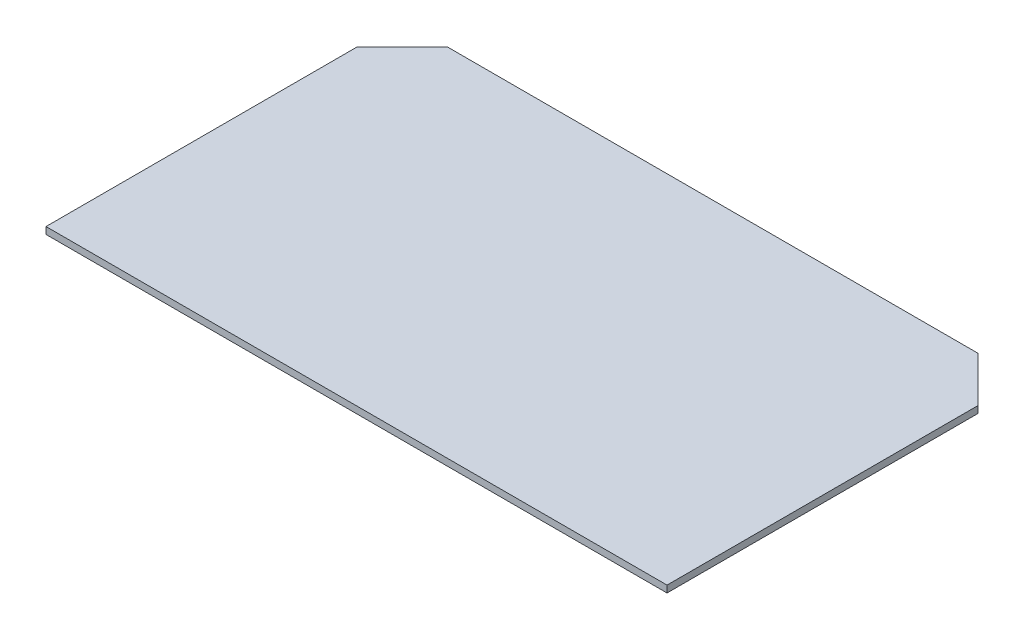
ISO-10303-21;
HEADER;
FILE_DESCRIPTION(('STEP AP214'),'2;1');
FILE_NAME('part.step','',(''),(''),'','','');
FILE_SCHEMA(('AUTOMOTIVE_DESIGN { 1 0 10303 214 1 1 1 1 }'));
ENDSEC;
DATA;
#1=APPLICATION_CONTEXT('core data for automotive mechanical design processes');
#2=APPLICATION_PROTOCOL_DEFINITION('international standard','automotive_design',2000,#1);
#3=PRODUCT_CONTEXT('',#1,'mechanical');
#4=PRODUCT('Part','Part','',(#3));
#5=PRODUCT_RELATED_PRODUCT_CATEGORY('part','',(#4));
#6=PRODUCT_DEFINITION_FORMATION('','',#4);
#7=PRODUCT_DEFINITION_CONTEXT('part definition',#1,'design');
#8=PRODUCT_DEFINITION('design','',#6,#7);
#9=PRODUCT_DEFINITION_SHAPE('','',#8);
#10=(LENGTH_UNIT() NAMED_UNIT(*) SI_UNIT(.MILLI.,.METRE.));
#11=(NAMED_UNIT(*) PLANE_ANGLE_UNIT() SI_UNIT($,.RADIAN.));
#12=(NAMED_UNIT(*) SI_UNIT($,.STERADIAN.) SOLID_ANGLE_UNIT());
#13=UNCERTAINTY_MEASURE_WITH_UNIT(LENGTH_MEASURE(1.E-05),#10,'distance_accuracy_value','');
#14=(GEOMETRIC_REPRESENTATION_CONTEXT(3) GLOBAL_UNCERTAINTY_ASSIGNED_CONTEXT((#13)) GLOBAL_UNIT_ASSIGNED_CONTEXT((#10,
#11,#12)) REPRESENTATION_CONTEXT('',''));
#15=CARTESIAN_POINT('',(0.,0.,0.));
#16=DIRECTION('',(0.,0.,1.));
#17=DIRECTION('',(1.,0.,0.));
#18=AXIS2_PLACEMENT_3D('',#15,#16,#17);
#19=CARTESIAN_POINT('',(-41.2422972226057,0.762,-27.8921894511264));
#20=DIRECTION('',(0.707106781186546,0.,0.707106781186548));
#21=DIRECTION('',(0.707106781186548,0.,-0.707106781186547));
#22=AXIS2_PLACEMENT_3D('',#19,#20,#21);
#23=PLANE('',#22);
#24=DIRECTION('',(-0.707106781186548,0.,0.707106781186547));
#25=VECTOR('',#24,1.);
#26=CARTESIAN_POINT('',(-41.2422972226057,0.,-27.8921894511264));
#27=LINE('',#26,#25);
#28=CARTESIAN_POINT('',(-41.2422972226057,0.,-27.8921894511264));
#29=VERTEX_POINT('',#28);
#30=CARTESIAN_POINT('',(-46.2712406504045,0.,-22.8632460233277));
#31=VERTEX_POINT('',#30);
#32=EDGE_CURVE('E118',#29,#31,#27,.T.);
#33=ORIENTED_EDGE('',*,*,#32,.T.);
#34=DIRECTION('',(0.,-1.,0.));
#35=VECTOR('',#34,1.);
#36=CARTESIAN_POINT('',(-46.2712406504045,0.762,-22.8632460233277));
#37=LINE('',#36,#35);
#38=CARTESIAN_POINT('',(-46.2712406504045,0.762,-22.8632460233277));
#39=VERTEX_POINT('',#38);
#40=EDGE_CURVE('E11',#39,#31,#37,.T.);
#41=ORIENTED_EDGE('',*,*,#40,.F.);
#42=DIRECTION('',(-0.707106781186548,0.,0.707106781186547));
#43=VECTOR('',#42,1.);
#44=CARTESIAN_POINT('',(-41.2422972226057,0.762,-27.8921894511264));
#45=LINE('',#44,#43);
#46=CARTESIAN_POINT('',(-41.2422972226057,0.762,-27.8921894511264));
#47=VERTEX_POINT('',#46);
#48=EDGE_CURVE('E128',#47,#39,#45,.T.);
#49=ORIENTED_EDGE('',*,*,#48,.F.);
#50=DIRECTION('',(0.,-1.,0.));
#51=VECTOR('',#50,1.);
#52=CARTESIAN_POINT('',(-41.2422972226057,0.762,-27.8921894511264));
#53=LINE('',#52,#51);
#54=EDGE_CURVE('E114',#47,#29,#53,.T.);
#55=ORIENTED_EDGE('',*,*,#54,.T.);
#56=EDGE_LOOP('',(#33,#41,#49,#55));
#57=FACE_BOUND('',#56,.T.);
#58=ADVANCED_FACE('F34',(#57),#23,.F.);
#59=CARTESIAN_POINT('',(-46.2712406504045,0.762,-22.8632460233277));
#60=DIRECTION('',(1.,0.,0.));
#61=DIRECTION('',(0.,0.,-1.));
#62=AXIS2_PLACEMENT_3D('',#59,#60,#61);
#63=PLANE('',#62);
#64=DIRECTION('',(0.,0.,1.));
#65=VECTOR('',#64,1.);
#66=CARTESIAN_POINT('',(-46.2712406504045,0.,-22.8632460233277));
#67=LINE('',#66,#65);
#68=CARTESIAN_POINT('',(-46.2712406504045,0.,11.6807539766723));
#69=VERTEX_POINT('',#68);
#70=EDGE_CURVE('E121',#31,#69,#67,.T.);
#71=ORIENTED_EDGE('',*,*,#70,.T.);
#72=DIRECTION('',(0.,-1.,0.));
#73=VECTOR('',#72,1.);
#74=CARTESIAN_POINT('',(-46.2712406504045,0.762,11.6807539766723));
#75=LINE('',#74,#73);
#76=CARTESIAN_POINT('',(-46.2712406504045,0.762,11.6807539766723));
#77=VERTEX_POINT('',#76);
#78=EDGE_CURVE('E42',#77,#69,#75,.T.);
#79=ORIENTED_EDGE('',*,*,#78,.F.);
#80=DIRECTION('',(0.,0.,1.));
#81=VECTOR('',#80,1.);
#82=CARTESIAN_POINT('',(-46.2712406504045,0.762,-22.8632460233277));
#83=LINE('',#82,#81);
#84=EDGE_CURVE('E87',#39,#77,#83,.T.);
#85=ORIENTED_EDGE('',*,*,#84,.F.);
#86=ORIENTED_EDGE('',*,*,#40,.T.);
#87=EDGE_LOOP('',(#71,#79,#85,#86));
#88=FACE_BOUND('',#87,.T.);
#89=ADVANCED_FACE('F152',(#88),#63,.F.);
#90=CARTESIAN_POINT('',(-46.2712406504045,0.762,11.6807539766723));
#91=DIRECTION('',(0.,0.,-1.));
#92=DIRECTION('',(-1.,0.,0.));
#93=AXIS2_PLACEMENT_3D('',#90,#91,#92);
#94=PLANE('',#93);
#95=DIRECTION('',(1.,0.,0.));
#96=VECTOR('',#95,1.);
#97=CARTESIAN_POINT('',(-46.2712406504045,0.,11.6807539766723));
#98=LINE('',#97,#96);
#99=CARTESIAN_POINT('',(22.714646205193,0.,11.6807539766723));
#100=VERTEX_POINT('',#99);
#101=EDGE_CURVE('E123',#69,#100,#98,.T.);
#102=ORIENTED_EDGE('',*,*,#101,.T.);
#103=DIRECTION('',(0.,-1.,0.));
#104=VECTOR('',#103,1.);
#105=CARTESIAN_POINT('',(22.714646205193,0.762,11.6807539766723));
#106=LINE('',#105,#104);
#107=CARTESIAN_POINT('',(22.714646205193,0.762,11.6807539766723));
#108=VERTEX_POINT('',#107);
#109=EDGE_CURVE('E109',#108,#100,#106,.T.);
#110=ORIENTED_EDGE('',*,*,#109,.F.);
#111=DIRECTION('',(1.,0.,0.));
#112=VECTOR('',#111,1.);
#113=CARTESIAN_POINT('',(-46.2712406504045,0.762,11.6807539766723));
#114=LINE('',#113,#112);
#115=EDGE_CURVE('E100',#77,#108,#114,.T.);
#116=ORIENTED_EDGE('',*,*,#115,.F.);
#117=ORIENTED_EDGE('',*,*,#78,.T.);
#118=EDGE_LOOP('',(#102,#110,#116,#117));
#119=FACE_BOUND('',#118,.T.);
#120=ADVANCED_FACE('F134',(#119),#94,.F.);
#121=CARTESIAN_POINT('',(22.714646205193,0.762,11.6807539766723));
#122=DIRECTION('',(-1.,0.,0.));
#123=DIRECTION('',(0.,0.,1.));
#124=AXIS2_PLACEMENT_3D('',#121,#122,#123);
#125=PLANE('',#124);
#126=DIRECTION('',(0.,0.,-1.));
#127=VECTOR('',#126,1.);
#128=CARTESIAN_POINT('',(22.714646205193,0.,11.6807539766723));
#129=LINE('',#128,#127);
#130=CARTESIAN_POINT('',(22.714646205193,0.,-22.8632460233277));
#131=VERTEX_POINT('',#130);
#132=EDGE_CURVE('E108',#100,#131,#129,.T.);
#133=ORIENTED_EDGE('',*,*,#132,.T.);
#134=DIRECTION('',(0.,-1.,0.));
#135=VECTOR('',#134,1.);
#136=CARTESIAN_POINT('',(22.714646205193,0.762,-22.8632460233277));
#137=LINE('',#136,#135);
#138=CARTESIAN_POINT('',(22.714646205193,0.762,-22.8632460233277));
#139=VERTEX_POINT('',#138);
#140=EDGE_CURVE('E105',#139,#131,#137,.T.);
#141=ORIENTED_EDGE('',*,*,#140,.F.);
#142=DIRECTION('',(0.,0.,-1.));
#143=VECTOR('',#142,1.);
#144=CARTESIAN_POINT('',(22.714646205193,0.762,11.6807539766723));
#145=LINE('',#144,#143);
#146=EDGE_CURVE('E94',#108,#139,#145,.T.);
#147=ORIENTED_EDGE('',*,*,#146,.F.);
#148=ORIENTED_EDGE('',*,*,#109,.T.);
#149=EDGE_LOOP('',(#133,#141,#147,#148));
#150=FACE_BOUND('',#149,.T.);
#151=ADVANCED_FACE('F106',(#150),#125,.F.);
#152=CARTESIAN_POINT('',(22.714646205193,0.762,-22.8632460233277));
#153=DIRECTION('',(-0.707106781186546,0.,0.707106781186549));
#154=DIRECTION('',(0.707106781186549,0.,0.707106781186546));
#155=AXIS2_PLACEMENT_3D('',#152,#153,#154);
#156=PLANE('',#155);
#157=DIRECTION('',(-0.707106781186549,0.,-0.707106781186546));
#158=VECTOR('',#157,1.);
#159=CARTESIAN_POINT('',(22.714646205193,0.,-22.8632460233277));
#160=LINE('',#159,#158);
#161=CARTESIAN_POINT('',(17.6857027773943,0.,-27.8921894511264));
#162=VERTEX_POINT('',#161);
#163=EDGE_CURVE('E73',#131,#162,#160,.T.);
#164=ORIENTED_EDGE('',*,*,#163,.T.);
#165=DIRECTION('',(0.,-1.,0.));
#166=VECTOR('',#165,1.);
#167=CARTESIAN_POINT('',(17.6857027773943,0.762,-27.8921894511264));
#168=LINE('',#167,#166);
#169=CARTESIAN_POINT('',(17.6857027773943,0.762,-27.8921894511264));
#170=VERTEX_POINT('',#169);
#171=EDGE_CURVE('E110',#170,#162,#168,.T.);
#172=ORIENTED_EDGE('',*,*,#171,.F.);
#173=DIRECTION('',(-0.707106781186549,0.,-0.707106781186546));
#174=VECTOR('',#173,1.);
#175=CARTESIAN_POINT('',(22.714646205193,0.762,-22.8632460233277));
#176=LINE('',#175,#174);
#177=EDGE_CURVE('E98',#139,#170,#176,.T.);
#178=ORIENTED_EDGE('',*,*,#177,.F.);
#179=ORIENTED_EDGE('',*,*,#140,.T.);
#180=EDGE_LOOP('',(#164,#172,#178,#179));
#181=FACE_BOUND('',#180,.T.);
#182=ADVANCED_FACE('F112',(#181),#156,.F.);
#183=CARTESIAN_POINT('',(17.6857027773943,0.762,-27.8921894511264));
#184=DIRECTION('',(0.,0.,1.));
#185=DIRECTION('',(1.,0.,0.));
#186=AXIS2_PLACEMENT_3D('',#183,#184,#185);
#187=PLANE('',#186);
#188=DIRECTION('',(-1.,0.,0.));
#189=VECTOR('',#188,1.);
#190=CARTESIAN_POINT('',(17.6857027773943,0.,-27.8921894511264));
#191=LINE('',#190,#189);
#192=EDGE_CURVE('E79',#162,#29,#191,.T.);
#193=ORIENTED_EDGE('',*,*,#192,.T.);
#194=ORIENTED_EDGE('',*,*,#54,.F.);
#195=DIRECTION('',(-1.,0.,0.));
#196=VECTOR('',#195,1.);
#197=CARTESIAN_POINT('',(17.6857027773943,0.762,-27.8921894511264));
#198=LINE('',#197,#196);
#199=EDGE_CURVE('E50',#170,#47,#198,.T.);
#200=ORIENTED_EDGE('',*,*,#199,.F.);
#201=ORIENTED_EDGE('',*,*,#171,.T.);
#202=EDGE_LOOP('',(#193,#194,#200,#201));
#203=FACE_BOUND('',#202,.T.);
#204=ADVANCED_FACE('F141',(#203),#187,.F.);
#205=CARTESIAN_POINT('',(0.,0.762,0.));
#206=DIRECTION('',(0.,-1.,0.));
#207=DIRECTION('',(0.,0.,-1.));
#208=AXIS2_PLACEMENT_3D('',#205,#206,#207);
#209=PLANE('',#208);
#210=ORIENTED_EDGE('',*,*,#48,.T.);
#211=ORIENTED_EDGE('',*,*,#84,.T.);
#212=ORIENTED_EDGE('',*,*,#115,.T.);
#213=ORIENTED_EDGE('',*,*,#146,.T.);
#214=ORIENTED_EDGE('',*,*,#177,.T.);
#215=ORIENTED_EDGE('',*,*,#199,.T.);
#216=EDGE_LOOP('',(#210,#211,#212,#213,#214,#215));
#217=FACE_BOUND('',#216,.T.);
#218=ADVANCED_FACE('F96',(#217),#209,.F.);
#219=CARTESIAN_POINT('',(0.,0.,0.));
#220=DIRECTION('',(0.,-1.,0.));
#221=DIRECTION('',(0.,0.,-1.));
#222=AXIS2_PLACEMENT_3D('',#219,#220,#221);
#223=PLANE('',#222);
#224=ORIENTED_EDGE('',*,*,#32,.F.);
#225=ORIENTED_EDGE('',*,*,#192,.F.);
#226=ORIENTED_EDGE('',*,*,#163,.F.);
#227=ORIENTED_EDGE('',*,*,#132,.F.);
#228=ORIENTED_EDGE('',*,*,#101,.F.);
#229=ORIENTED_EDGE('',*,*,#70,.F.);
#230=EDGE_LOOP('',(#224,#225,#226,#227,#228,#229));
#231=FACE_BOUND('',#230,.T.);
#232=ADVANCED_FACE('F137',(#231),#223,.T.);
#233=CLOSED_SHELL('',(#58,#89,#120,#151,#182,#204,#218,#232));
#234=MANIFOLD_SOLID_BREP('B2',#233);
#235=ADVANCED_BREP_SHAPE_REPRESENTATION('',(#18,#234),#14);
#236=SHAPE_DEFINITION_REPRESENTATION(#9,#235);
ENDSEC;
END-ISO-10303-21;
